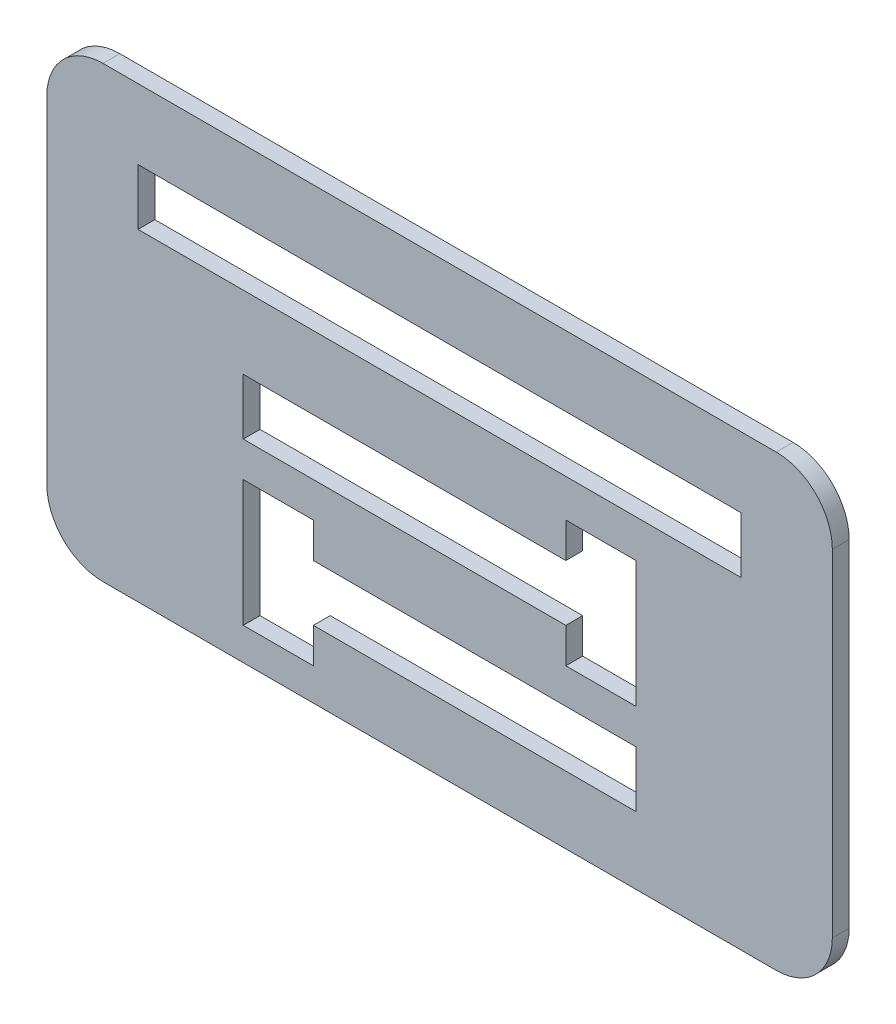
ISO-10303-21;
HEADER;
FILE_DESCRIPTION(('STEP AP214'),'2;1');
FILE_NAME('part.step','',(''),(''),'','','');
FILE_SCHEMA(('AUTOMOTIVE_DESIGN { 1 0 10303 214 1 1 1 1 }'));
ENDSEC;
DATA;
#1=APPLICATION_CONTEXT('core data for automotive mechanical design processes');
#2=APPLICATION_PROTOCOL_DEFINITION('international standard','automotive_design',2000,#1);
#3=PRODUCT_CONTEXT('',#1,'mechanical');
#4=PRODUCT('Part','Part','',(#3));
#5=PRODUCT_RELATED_PRODUCT_CATEGORY('part','',(#4));
#6=PRODUCT_DEFINITION_FORMATION('','',#4);
#7=PRODUCT_DEFINITION_CONTEXT('part definition',#1,'design');
#8=PRODUCT_DEFINITION('design','',#6,#7);
#9=PRODUCT_DEFINITION_SHAPE('','',#8);
#10=(LENGTH_UNIT() NAMED_UNIT(*) SI_UNIT(.MILLI.,.METRE.));
#11=(NAMED_UNIT(*) PLANE_ANGLE_UNIT() SI_UNIT($,.RADIAN.));
#12=(NAMED_UNIT(*) SI_UNIT($,.STERADIAN.) SOLID_ANGLE_UNIT());
#13=UNCERTAINTY_MEASURE_WITH_UNIT(LENGTH_MEASURE(1.E-05),#10,'distance_accuracy_value','');
#14=(GEOMETRIC_REPRESENTATION_CONTEXT(3) GLOBAL_UNCERTAINTY_ASSIGNED_CONTEXT((#13)) GLOBAL_UNIT_ASSIGNED_CONTEXT((#10,
#11,#12)) REPRESENTATION_CONTEXT('',''));
#15=CARTESIAN_POINT('',(0.,0.,0.));
#16=DIRECTION('',(0.,0.,1.));
#17=DIRECTION('',(1.,0.,0.));
#18=AXIS2_PLACEMENT_3D('',#15,#16,#17);
#19=CARTESIAN_POINT('',(260.,20.,6.));
#20=DIRECTION('',(0.,0.,-1.));
#21=DIRECTION('',(-1.,0.,0.));
#22=AXIS2_PLACEMENT_3D('',#19,#20,#21);
#23=CYLINDRICAL_SURFACE('',#22,20.);
#24=CARTESIAN_POINT('',(260.,20.,0.));
#25=DIRECTION('',(0.,0.,1.));
#26=DIRECTION('',(1.,0.,0.));
#27=AXIS2_PLACEMENT_3D('',#24,#25,#26);
#28=CIRCLE('',#27,20.);
#29=CARTESIAN_POINT('',(260.,0.,0.));
#30=VERTEX_POINT('',#29);
#31=CARTESIAN_POINT('',(280.,20.0000000000001,0.));
#32=VERTEX_POINT('',#31);
#33=EDGE_CURVE('E376',#30,#32,#28,.T.);
#34=ORIENTED_EDGE('',*,*,#33,.T.);
#35=DIRECTION('',(0.,0.,-1.));
#36=VECTOR('',#35,1.);
#37=CARTESIAN_POINT('',(280.,20.0000000000001,6.));
#38=LINE('',#37,#36);
#39=CARTESIAN_POINT('',(280.,20.0000000000001,6.));
#40=VERTEX_POINT('',#39);
#41=EDGE_CURVE('E11',#40,#32,#38,.T.);
#42=ORIENTED_EDGE('',*,*,#41,.F.);
#43=CARTESIAN_POINT('',(260.,20.,6.));
#44=DIRECTION('',(0.,0.,1.));
#45=DIRECTION('',(1.,0.,0.));
#46=AXIS2_PLACEMENT_3D('',#43,#44,#45);
#47=CIRCLE('',#46,20.);
#48=CARTESIAN_POINT('',(260.,0.,6.));
#49=VERTEX_POINT('',#48);
#50=EDGE_CURVE('E383',#49,#40,#47,.T.);
#51=ORIENTED_EDGE('',*,*,#50,.F.);
#52=DIRECTION('',(0.,0.,-1.));
#53=VECTOR('',#52,1.);
#54=CARTESIAN_POINT('',(260.,0.,6.));
#55=LINE('',#54,#53);
#56=EDGE_CURVE('E401',#49,#30,#55,.T.);
#57=ORIENTED_EDGE('',*,*,#56,.T.);
#58=EDGE_LOOP('',(#34,#42,#51,#57));
#59=FACE_BOUND('',#58,.T.);
#60=ADVANCED_FACE('F33',(#59),#23,.T.);
#61=CARTESIAN_POINT('',(280.,20.0000000000001,6.));
#62=DIRECTION('',(-1.,0.,0.));
#63=DIRECTION('',(0.,-1.,0.));
#64=AXIS2_PLACEMENT_3D('',#61,#62,#63);
#65=PLANE('',#64);
#66=DIRECTION('',(0.,1.,0.));
#67=VECTOR('',#66,1.);
#68=CARTESIAN_POINT('',(280.,20.0000000000001,0.));
#69=LINE('',#68,#67);
#70=CARTESIAN_POINT('',(280.,140.,0.));
#71=VERTEX_POINT('',#70);
#72=EDGE_CURVE('E404',#32,#71,#69,.T.);
#73=ORIENTED_EDGE('',*,*,#72,.T.);
#74=DIRECTION('',(0.,0.,-1.));
#75=VECTOR('',#74,1.);
#76=CARTESIAN_POINT('',(280.,140.,6.));
#77=LINE('',#76,#75);
#78=CARTESIAN_POINT('',(280.,140.,6.));
#79=VERTEX_POINT('',#78);
#80=EDGE_CURVE('E40',#79,#71,#77,.T.);
#81=ORIENTED_EDGE('',*,*,#80,.F.);
#82=DIRECTION('',(0.,1.,0.));
#83=VECTOR('',#82,1.);
#84=CARTESIAN_POINT('',(280.,20.0000000000001,6.));
#85=LINE('',#84,#83);
#86=EDGE_CURVE('E386',#40,#79,#85,.T.);
#87=ORIENTED_EDGE('',*,*,#86,.F.);
#88=ORIENTED_EDGE('',*,*,#41,.T.);
#89=EDGE_LOOP('',(#73,#81,#87,#88));
#90=FACE_BOUND('',#89,.T.);
#91=ADVANCED_FACE('F460',(#90),#65,.F.);
#92=CARTESIAN_POINT('',(260.,140.,6.));
#93=DIRECTION('',(0.,0.,-1.));
#94=DIRECTION('',(-1.,0.,0.));
#95=AXIS2_PLACEMENT_3D('',#92,#93,#94);
#96=CYLINDRICAL_SURFACE('',#95,20.);
#97=CARTESIAN_POINT('',(260.,140.,0.));
#98=DIRECTION('',(0.,0.,1.));
#99=DIRECTION('',(-1.,0.,0.));
#100=AXIS2_PLACEMENT_3D('',#97,#98,#99);
#101=CIRCLE('',#100,20.);
#102=CARTESIAN_POINT('',(260.,160.,0.));
#103=VERTEX_POINT('',#102);
#104=EDGE_CURVE('E406',#71,#103,#101,.T.);
#105=ORIENTED_EDGE('',*,*,#104,.T.);
#106=DIRECTION('',(0.,0.,-1.));
#107=VECTOR('',#106,1.);
#108=CARTESIAN_POINT('',(260.,160.,6.));
#109=LINE('',#108,#107);
#110=CARTESIAN_POINT('',(260.,160.,6.));
#111=VERTEX_POINT('',#110);
#112=EDGE_CURVE('E431',#111,#103,#109,.T.);
#113=ORIENTED_EDGE('',*,*,#112,.F.);
#114=CARTESIAN_POINT('',(260.,140.,6.));
#115=DIRECTION('',(0.,0.,1.));
#116=DIRECTION('',(-1.,0.,0.));
#117=AXIS2_PLACEMENT_3D('',#114,#115,#116);
#118=CIRCLE('',#117,20.);
#119=EDGE_CURVE('E389',#79,#111,#118,.T.);
#120=ORIENTED_EDGE('',*,*,#119,.F.);
#121=ORIENTED_EDGE('',*,*,#80,.T.);
#122=EDGE_LOOP('',(#105,#113,#120,#121));
#123=FACE_BOUND('',#122,.T.);
#124=ADVANCED_FACE('F438',(#123),#96,.T.);
#125=CARTESIAN_POINT('',(20.0000000000001,160.,6.));
#126=DIRECTION('',(0.,-1.,0.));
#127=DIRECTION('',(0.,0.,-1.));
#128=AXIS2_PLACEMENT_3D('',#125,#126,#127);
#129=PLANE('',#128);
#130=DIRECTION('',(-1.,0.,0.));
#131=VECTOR('',#130,1.);
#132=CARTESIAN_POINT('',(20.0000000000001,160.,0.));
#133=LINE('',#132,#131);
#134=CARTESIAN_POINT('',(20.0000000000001,160.,0.));
#135=VERTEX_POINT('',#134);
#136=EDGE_CURVE('E408',#103,#135,#133,.T.);
#137=ORIENTED_EDGE('',*,*,#136,.T.);
#138=DIRECTION('',(0.,0.,-1.));
#139=VECTOR('',#138,1.);
#140=CARTESIAN_POINT('',(20.0000000000001,160.,6.));
#141=LINE('',#140,#139);
#142=CARTESIAN_POINT('',(20.0000000000001,160.,6.));
#143=VERTEX_POINT('',#142);
#144=EDGE_CURVE('E428',#143,#135,#141,.T.);
#145=ORIENTED_EDGE('',*,*,#144,.F.);
#146=DIRECTION('',(-1.,0.,0.));
#147=VECTOR('',#146,1.);
#148=CARTESIAN_POINT('',(20.0000000000001,160.,6.));
#149=LINE('',#148,#147);
#150=EDGE_CURVE('E391',#111,#143,#149,.T.);
#151=ORIENTED_EDGE('',*,*,#150,.F.);
#152=ORIENTED_EDGE('',*,*,#112,.T.);
#153=EDGE_LOOP('',(#137,#145,#151,#152));
#154=FACE_BOUND('',#153,.T.);
#155=ADVANCED_FACE('F448',(#154),#129,.F.);
#156=CARTESIAN_POINT('',(20.,140.,6.));
#157=DIRECTION('',(0.,0.,-1.));
#158=DIRECTION('',(-1.,0.,0.));
#159=AXIS2_PLACEMENT_3D('',#156,#157,#158);
#160=CYLINDRICAL_SURFACE('',#159,20.);
#161=CARTESIAN_POINT('',(20.,140.,0.));
#162=DIRECTION('',(0.,0.,1.));
#163=DIRECTION('',(-1.,0.,0.));
#164=AXIS2_PLACEMENT_3D('',#161,#162,#163);
#165=CIRCLE('',#164,20.);
#166=CARTESIAN_POINT('',(0.,140.,0.));
#167=VERTEX_POINT('',#166);
#168=EDGE_CURVE('E410',#135,#167,#165,.T.);
#169=ORIENTED_EDGE('',*,*,#168,.T.);
#170=DIRECTION('',(0.,0.,-1.));
#171=VECTOR('',#170,1.);
#172=CARTESIAN_POINT('',(0.,140.,6.));
#173=LINE('',#172,#171);
#174=CARTESIAN_POINT('',(0.,140.,6.));
#175=VERTEX_POINT('',#174);
#176=EDGE_CURVE('E425',#175,#167,#173,.T.);
#177=ORIENTED_EDGE('',*,*,#176,.F.);
#178=CARTESIAN_POINT('',(20.,140.,6.));
#179=DIRECTION('',(0.,0.,1.));
#180=DIRECTION('',(-1.,0.,0.));
#181=AXIS2_PLACEMENT_3D('',#178,#179,#180);
#182=CIRCLE('',#181,20.);
#183=EDGE_CURVE('E393',#143,#175,#182,.T.);
#184=ORIENTED_EDGE('',*,*,#183,.F.);
#185=ORIENTED_EDGE('',*,*,#144,.T.);
#186=EDGE_LOOP('',(#169,#177,#184,#185));
#187=FACE_BOUND('',#186,.T.);
#188=ADVANCED_FACE('F452',(#187),#160,.T.);
#189=CARTESIAN_POINT('',(0.,20.0000000000001,6.));
#190=DIRECTION('',(1.,0.,0.));
#191=DIRECTION('',(0.,1.,0.));
#192=AXIS2_PLACEMENT_3D('',#189,#190,#191);
#193=PLANE('',#192);
#194=DIRECTION('',(0.,-1.,0.));
#195=VECTOR('',#194,1.);
#196=CARTESIAN_POINT('',(0.,20.0000000000001,0.));
#197=LINE('',#196,#195);
#198=CARTESIAN_POINT('',(0.,20.,0.));
#199=VERTEX_POINT('',#198);
#200=EDGE_CURVE('E412',#167,#199,#197,.T.);
#201=ORIENTED_EDGE('',*,*,#200,.T.);
#202=DIRECTION('',(0.,0.,-1.));
#203=VECTOR('',#202,1.);
#204=CARTESIAN_POINT('',(0.,20.,6.));
#205=LINE('',#204,#203);
#206=CARTESIAN_POINT('',(0.,20.,6.));
#207=VERTEX_POINT('',#206);
#208=EDGE_CURVE('E422',#207,#199,#205,.T.);
#209=ORIENTED_EDGE('',*,*,#208,.F.);
#210=DIRECTION('',(0.,-1.,0.));
#211=VECTOR('',#210,1.);
#212=CARTESIAN_POINT('',(0.,20.0000000000001,6.));
#213=LINE('',#212,#211);
#214=EDGE_CURVE('E395',#175,#207,#213,.T.);
#215=ORIENTED_EDGE('',*,*,#214,.F.);
#216=ORIENTED_EDGE('',*,*,#176,.T.);
#217=EDGE_LOOP('',(#201,#209,#215,#216));
#218=FACE_BOUND('',#217,.T.);
#219=ADVANCED_FACE('F473',(#218),#193,.F.);
#220=CARTESIAN_POINT('',(20.,20.,6.));
#221=DIRECTION('',(0.,0.,-1.));
#222=DIRECTION('',(-1.,0.,0.));
#223=AXIS2_PLACEMENT_3D('',#220,#221,#222);
#224=CYLINDRICAL_SURFACE('',#223,20.);
#225=CARTESIAN_POINT('',(20.,20.,0.));
#226=DIRECTION('',(0.,0.,1.));
#227=DIRECTION('',(-1.,0.,0.));
#228=AXIS2_PLACEMENT_3D('',#225,#226,#227);
#229=CIRCLE('',#228,20.);
#230=CARTESIAN_POINT('',(20.0000000000001,0.,0.));
#231=VERTEX_POINT('',#230);
#232=EDGE_CURVE('E414',#199,#231,#229,.T.);
#233=ORIENTED_EDGE('',*,*,#232,.T.);
#234=DIRECTION('',(0.,0.,-1.));
#235=VECTOR('',#234,1.);
#236=CARTESIAN_POINT('',(20.0000000000001,0.,6.));
#237=LINE('',#236,#235);
#238=CARTESIAN_POINT('',(20.0000000000001,0.,6.));
#239=VERTEX_POINT('',#238);
#240=EDGE_CURVE('E419',#239,#231,#237,.T.);
#241=ORIENTED_EDGE('',*,*,#240,.F.);
#242=CARTESIAN_POINT('',(20.,20.,6.));
#243=DIRECTION('',(0.,0.,1.));
#244=DIRECTION('',(-1.,0.,0.));
#245=AXIS2_PLACEMENT_3D('',#242,#243,#244);
#246=CIRCLE('',#245,20.);
#247=EDGE_CURVE('E397',#207,#239,#246,.T.);
#248=ORIENTED_EDGE('',*,*,#247,.F.);
#249=ORIENTED_EDGE('',*,*,#208,.T.);
#250=EDGE_LOOP('',(#233,#241,#248,#249));
#251=FACE_BOUND('',#250,.T.);
#252=ADVANCED_FACE('F471',(#251),#224,.T.);
#253=CARTESIAN_POINT('',(20.0000000000001,0.,6.));
#254=DIRECTION('',(0.,1.,0.));
#255=DIRECTION('',(0.,0.,1.));
#256=AXIS2_PLACEMENT_3D('',#253,#254,#255);
#257=PLANE('',#256);
#258=DIRECTION('',(1.,0.,0.));
#259=VECTOR('',#258,1.);
#260=CARTESIAN_POINT('',(20.0000000000001,0.,0.));
#261=LINE('',#260,#259);
#262=EDGE_CURVE('E387',#231,#30,#261,.T.);
#263=ORIENTED_EDGE('',*,*,#262,.T.);
#264=ORIENTED_EDGE('',*,*,#56,.F.);
#265=DIRECTION('',(1.,0.,0.));
#266=VECTOR('',#265,1.);
#267=CARTESIAN_POINT('',(20.0000000000001,0.,6.));
#268=LINE('',#267,#266);
#269=EDGE_CURVE('E399',#239,#49,#268,.T.);
#270=ORIENTED_EDGE('',*,*,#269,.F.);
#271=ORIENTED_EDGE('',*,*,#240,.T.);
#272=EDGE_LOOP('',(#263,#264,#270,#271));
#273=FACE_BOUND('',#272,.T.);
#274=ADVANCED_FACE('F466',(#273),#257,.F.);
#275=CARTESIAN_POINT('',(260.,20.,6.));
#276=DIRECTION('',(0.,0.,1.));
#277=DIRECTION('',(1.,0.,0.));
#278=AXIS2_PLACEMENT_3D('',#275,#276,#277);
#279=PLANE('',#278);
#280=DIRECTION('',(-1.,0.,0.));
#281=VECTOR('',#280,1.);
#282=CARTESIAN_POINT('',(95.,56.5139018339302,6.));
#283=LINE('',#282,#281);
#284=CARTESIAN_POINT('',(95.,56.5139018339302,6.));
#285=VERTEX_POINT('',#284);
#286=CARTESIAN_POINT('',(70.,56.5139018339302,6.));
#287=VERTEX_POINT('',#286);
#288=EDGE_CURVE('E47',#285,#287,#283,.T.);
#289=ORIENTED_EDGE('',*,*,#288,.F.);
#290=DIRECTION('',(0.,1.,0.));
#291=VECTOR('',#290,1.);
#292=CARTESIAN_POINT('',(95.,56.5139018339302,6.));
#293=LINE('',#292,#291);
#294=CARTESIAN_POINT('',(95.,44.0139018339303,6.));
#295=VERTEX_POINT('',#294);
#296=EDGE_CURVE('E239',#295,#285,#293,.T.);
#297=ORIENTED_EDGE('',*,*,#296,.F.);
#298=DIRECTION('',(-1.,0.,0.));
#299=VECTOR('',#298,1.);
#300=CARTESIAN_POINT('',(210.,44.0139018339303,6.));
#301=LINE('',#300,#299);
#302=CARTESIAN_POINT('',(210.,44.0139018339303,6.));
#303=VERTEX_POINT('',#302);
#304=EDGE_CURVE('E242',#303,#295,#301,.T.);
#305=ORIENTED_EDGE('',*,*,#304,.F.);
#306=DIRECTION('',(0.,1.,0.));
#307=VECTOR('',#306,1.);
#308=CARTESIAN_POINT('',(210.,44.0139018339303,6.));
#309=LINE('',#308,#307);
#310=CARTESIAN_POINT('',(210.,24.0139018339303,6.));
#311=VERTEX_POINT('',#310);
#312=EDGE_CURVE('E270',#311,#303,#309,.T.);
#313=ORIENTED_EDGE('',*,*,#312,.F.);
#314=DIRECTION('',(1.,0.,0.));
#315=VECTOR('',#314,1.);
#316=CARTESIAN_POINT('',(210.,24.0139018339303,6.));
#317=LINE('',#316,#315);
#318=CARTESIAN_POINT('',(95.0000000000001,24.0139018339303,6.));
#319=VERTEX_POINT('',#318);
#320=EDGE_CURVE('E267',#319,#311,#317,.T.);
#321=ORIENTED_EDGE('',*,*,#320,.F.);
#322=DIRECTION('',(0.,1.,0.));
#323=VECTOR('',#322,1.);
#324=CARTESIAN_POINT('',(95.0000000000001,24.0139018339303,6.));
#325=LINE('',#324,#323);
#326=CARTESIAN_POINT('',(95.0000000000001,11.5139018339303,6.));
#327=VERTEX_POINT('',#326);
#328=EDGE_CURVE('E264',#327,#319,#325,.T.);
#329=ORIENTED_EDGE('',*,*,#328,.F.);
#330=DIRECTION('',(1.,0.,0.));
#331=VECTOR('',#330,1.);
#332=CARTESIAN_POINT('',(95.0000000000001,11.5139018339303,6.));
#333=LINE('',#332,#331);
#334=CARTESIAN_POINT('',(70.,11.5139018339303,6.));
#335=VERTEX_POINT('',#334);
#336=EDGE_CURVE('E261',#335,#327,#333,.T.);
#337=ORIENTED_EDGE('',*,*,#336,.F.);
#338=DIRECTION('',(0.,-1.,0.));
#339=VECTOR('',#338,1.);
#340=CARTESIAN_POINT('',(70.,56.5139018339302,6.));
#341=LINE('',#340,#339);
#342=EDGE_CURVE('E259',#287,#335,#341,.T.);
#343=ORIENTED_EDGE('',*,*,#342,.F.);
#344=EDGE_LOOP('',(#289,#297,#305,#313,#321,#329,#337,#343));
#345=FACE_BOUND('',#344,.T.);
#346=DIRECTION('',(0.,-1.,0.));
#347=VECTOR('',#346,1.);
#348=CARTESIAN_POINT('',(70.,89.0139018339302,6.));
#349=LINE('',#348,#347);
#350=CARTESIAN_POINT('',(70.,89.0139018339302,6.));
#351=VERTEX_POINT('',#350);
#352=CARTESIAN_POINT('',(70.,69.0139018339302,6.));
#353=VERTEX_POINT('',#352);
#354=EDGE_CURVE('E55',#351,#353,#349,.T.);
#355=ORIENTED_EDGE('',*,*,#354,.F.);
#356=DIRECTION('',(-1.,0.,0.));
#357=VECTOR('',#356,1.);
#358=CARTESIAN_POINT('',(70.,89.0139018339302,6.));
#359=LINE('',#358,#357);
#360=CARTESIAN_POINT('',(185.,89.0139018339302,6.));
#361=VERTEX_POINT('',#360);
#362=EDGE_CURVE('E292',#361,#351,#359,.T.);
#363=ORIENTED_EDGE('',*,*,#362,.F.);
#364=DIRECTION('',(0.,-1.,0.));
#365=VECTOR('',#364,1.);
#366=CARTESIAN_POINT('',(185.,101.51390183393,6.));
#367=LINE('',#366,#365);
#368=CARTESIAN_POINT('',(185.,101.51390183393,6.));
#369=VERTEX_POINT('',#368);
#370=EDGE_CURVE('E330',#369,#361,#367,.T.);
#371=ORIENTED_EDGE('',*,*,#370,.F.);
#372=DIRECTION('',(-1.,0.,0.));
#373=VECTOR('',#372,1.);
#374=CARTESIAN_POINT('',(185.,101.51390183393,6.));
#375=LINE('',#374,#373);
#376=CARTESIAN_POINT('',(210.,101.51390183393,6.));
#377=VERTEX_POINT('',#376);
#378=EDGE_CURVE('E327',#377,#369,#375,.T.);
#379=ORIENTED_EDGE('',*,*,#378,.F.);
#380=DIRECTION('',(0.,1.,0.));
#381=VECTOR('',#380,1.);
#382=CARTESIAN_POINT('',(210.,101.51390183393,6.));
#383=LINE('',#382,#381);
#384=CARTESIAN_POINT('',(210.,56.5139018339302,6.));
#385=VERTEX_POINT('',#384);
#386=EDGE_CURVE('E324',#385,#377,#383,.T.);
#387=ORIENTED_EDGE('',*,*,#386,.F.);
#388=DIRECTION('',(1.,0.,0.));
#389=VECTOR('',#388,1.);
#390=CARTESIAN_POINT('',(185.,56.5139018339302,6.));
#391=LINE('',#390,#389);
#392=CARTESIAN_POINT('',(185.,56.5139018339302,6.));
#393=VERTEX_POINT('',#392);
#394=EDGE_CURVE('E321',#393,#385,#391,.T.);
#395=ORIENTED_EDGE('',*,*,#394,.F.);
#396=DIRECTION('',(0.,-1.,0.));
#397=VECTOR('',#396,1.);
#398=CARTESIAN_POINT('',(185.,69.0139018339302,6.));
#399=LINE('',#398,#397);
#400=CARTESIAN_POINT('',(185.,69.0139018339302,6.));
#401=VERTEX_POINT('',#400);
#402=EDGE_CURVE('E318',#401,#393,#399,.T.);
#403=ORIENTED_EDGE('',*,*,#402,.F.);
#404=DIRECTION('',(1.,0.,0.));
#405=VECTOR('',#404,1.);
#406=CARTESIAN_POINT('',(70.,69.0139018339302,6.));
#407=LINE('',#406,#405);
#408=EDGE_CURVE('E315',#353,#401,#407,.T.);
#409=ORIENTED_EDGE('',*,*,#408,.F.);
#410=EDGE_LOOP('',(#355,#363,#371,#379,#387,#395,#403,#409));
#411=FACE_BOUND('',#410,.T.);
#412=DIRECTION('',(0.,-1.,0.));
#413=VECTOR('',#412,1.);
#414=CARTESIAN_POINT('',(32.5,135.,6.));
#415=LINE('',#414,#413);
#416=CARTESIAN_POINT('',(32.5,135.,6.));
#417=VERTEX_POINT('',#416);
#418=CARTESIAN_POINT('',(32.5,115.,6.));
#419=VERTEX_POINT('',#418);
#420=EDGE_CURVE('E337',#417,#419,#415,.T.);
#421=ORIENTED_EDGE('',*,*,#420,.F.);
#422=DIRECTION('',(-1.,0.,0.));
#423=VECTOR('',#422,1.);
#424=CARTESIAN_POINT('',(32.5,135.,6.));
#425=LINE('',#424,#423);
#426=CARTESIAN_POINT('',(247.5,135.,6.));
#427=VERTEX_POINT('',#426);
#428=EDGE_CURVE('E355',#427,#417,#425,.T.);
#429=ORIENTED_EDGE('',*,*,#428,.F.);
#430=DIRECTION('',(0.,1.,0.));
#431=VECTOR('',#430,1.);
#432=CARTESIAN_POINT('',(247.5,135.,6.));
#433=LINE('',#432,#431);
#434=CARTESIAN_POINT('',(247.5,115.,6.));
#435=VERTEX_POINT('',#434);
#436=EDGE_CURVE('E369',#435,#427,#433,.T.);
#437=ORIENTED_EDGE('',*,*,#436,.F.);
#438=DIRECTION('',(1.,0.,0.));
#439=VECTOR('',#438,1.);
#440=CARTESIAN_POINT('',(32.5,115.,6.));
#441=LINE('',#440,#439);
#442=EDGE_CURVE('E366',#419,#435,#441,.T.);
#443=ORIENTED_EDGE('',*,*,#442,.F.);
#444=EDGE_LOOP('',(#421,#429,#437,#443));
#445=FACE_BOUND('',#444,.T.);
#446=ORIENTED_EDGE('',*,*,#50,.T.);
#447=ORIENTED_EDGE('',*,*,#86,.T.);
#448=ORIENTED_EDGE('',*,*,#119,.T.);
#449=ORIENTED_EDGE('',*,*,#150,.T.);
#450=ORIENTED_EDGE('',*,*,#183,.T.);
#451=ORIENTED_EDGE('',*,*,#214,.T.);
#452=ORIENTED_EDGE('',*,*,#247,.T.);
#453=ORIENTED_EDGE('',*,*,#269,.T.);
#454=EDGE_LOOP('',(#446,#447,#448,#449,#450,#451,#452,#453));
#455=FACE_BOUND('',#454,.T.);
#456=ADVANCED_FACE('F456',(#345,#411,#445,#455),#279,.T.);
#457=CARTESIAN_POINT('',(260.,20.,0.));
#458=DIRECTION('',(0.,0.,1.));
#459=DIRECTION('',(1.,0.,0.));
#460=AXIS2_PLACEMENT_3D('',#457,#458,#459);
#461=PLANE('',#460);
#462=DIRECTION('',(0.,1.,0.));
#463=VECTOR('',#462,1.);
#464=CARTESIAN_POINT('',(95.,56.5139018339302,0.));
#465=LINE('',#464,#463);
#466=CARTESIAN_POINT('',(95.,44.0139018339303,0.));
#467=VERTEX_POINT('',#466);
#468=CARTESIAN_POINT('',(95.,56.5139018339302,0.));
#469=VERTEX_POINT('',#468);
#470=EDGE_CURVE('E225',#467,#469,#465,.T.);
#471=ORIENTED_EDGE('',*,*,#470,.T.);
#472=DIRECTION('',(-1.,0.,0.));
#473=VECTOR('',#472,1.);
#474=CARTESIAN_POINT('',(95.,56.5139018339302,0.));
#475=LINE('',#474,#473);
#476=CARTESIAN_POINT('',(70.,56.5139018339302,0.));
#477=VERTEX_POINT('',#476);
#478=EDGE_CURVE('E219',#469,#477,#475,.T.);
#479=ORIENTED_EDGE('',*,*,#478,.T.);
#480=DIRECTION('',(0.,-1.,0.));
#481=VECTOR('',#480,1.);
#482=CARTESIAN_POINT('',(70.,56.5139018339302,0.));
#483=LINE('',#482,#481);
#484=CARTESIAN_POINT('',(70.,11.5139018339303,0.));
#485=VERTEX_POINT('',#484);
#486=EDGE_CURVE('E229',#477,#485,#483,.T.);
#487=ORIENTED_EDGE('',*,*,#486,.T.);
#488=DIRECTION('',(1.,0.,0.));
#489=VECTOR('',#488,1.);
#490=CARTESIAN_POINT('',(95.0000000000001,11.5139018339303,0.));
#491=LINE('',#490,#489);
#492=CARTESIAN_POINT('',(95.0000000000001,11.5139018339303,0.));
#493=VERTEX_POINT('',#492);
#494=EDGE_CURVE('E233',#485,#493,#491,.T.);
#495=ORIENTED_EDGE('',*,*,#494,.T.);
#496=DIRECTION('',(0.,1.,0.));
#497=VECTOR('',#496,1.);
#498=CARTESIAN_POINT('',(95.0000000000001,24.0139018339303,0.));
#499=LINE('',#498,#497);
#500=CARTESIAN_POINT('',(95.0000000000001,24.0139018339303,0.));
#501=VERTEX_POINT('',#500);
#502=EDGE_CURVE('E246',#493,#501,#499,.T.);
#503=ORIENTED_EDGE('',*,*,#502,.T.);
#504=DIRECTION('',(1.,0.,0.));
#505=VECTOR('',#504,1.);
#506=CARTESIAN_POINT('',(210.,24.0139018339303,0.));
#507=LINE('',#506,#505);
#508=CARTESIAN_POINT('',(210.,24.0139018339303,0.));
#509=VERTEX_POINT('',#508);
#510=EDGE_CURVE('E249',#501,#509,#507,.T.);
#511=ORIENTED_EDGE('',*,*,#510,.T.);
#512=DIRECTION('',(0.,1.,0.));
#513=VECTOR('',#512,1.);
#514=CARTESIAN_POINT('',(210.,44.0139018339303,0.));
#515=LINE('',#514,#513);
#516=CARTESIAN_POINT('',(210.,44.0139018339303,0.));
#517=VERTEX_POINT('',#516);
#518=EDGE_CURVE('E252',#509,#517,#515,.T.);
#519=ORIENTED_EDGE('',*,*,#518,.T.);
#520=DIRECTION('',(-1.,0.,0.));
#521=VECTOR('',#520,1.);
#522=CARTESIAN_POINT('',(210.,44.0139018339303,0.));
#523=LINE('',#522,#521);
#524=EDGE_CURVE('E255',#517,#467,#523,.T.);
#525=ORIENTED_EDGE('',*,*,#524,.T.);
#526=EDGE_LOOP('',(#471,#479,#487,#495,#503,#511,#519,#525));
#527=FACE_BOUND('',#526,.T.);
#528=DIRECTION('',(-1.,0.,0.));
#529=VECTOR('',#528,1.);
#530=CARTESIAN_POINT('',(70.,89.0139018339302,0.));
#531=LINE('',#530,#529);
#532=CARTESIAN_POINT('',(185.,89.0139018339302,0.));
#533=VERTEX_POINT('',#532);
#534=CARTESIAN_POINT('',(70.,89.0139018339302,0.));
#535=VERTEX_POINT('',#534);
#536=EDGE_CURVE('E310',#533,#535,#531,.T.);
#537=ORIENTED_EDGE('',*,*,#536,.T.);
#538=DIRECTION('',(0.,-1.,0.));
#539=VECTOR('',#538,1.);
#540=CARTESIAN_POINT('',(70.,89.0139018339302,0.));
#541=LINE('',#540,#539);
#542=CARTESIAN_POINT('',(70.,69.0139018339302,0.));
#543=VERTEX_POINT('',#542);
#544=EDGE_CURVE('E288',#535,#543,#541,.T.);
#545=ORIENTED_EDGE('',*,*,#544,.T.);
#546=DIRECTION('',(1.,0.,0.));
#547=VECTOR('',#546,1.);
#548=CARTESIAN_POINT('',(70.,69.0139018339302,0.));
#549=LINE('',#548,#547);
#550=CARTESIAN_POINT('',(185.,69.0139018339302,0.));
#551=VERTEX_POINT('',#550);
#552=EDGE_CURVE('E291',#543,#551,#549,.T.);
#553=ORIENTED_EDGE('',*,*,#552,.T.);
#554=DIRECTION('',(0.,-1.,0.));
#555=VECTOR('',#554,1.);
#556=CARTESIAN_POINT('',(185.,69.0139018339302,0.));
#557=LINE('',#556,#555);
#558=CARTESIAN_POINT('',(185.,56.5139018339302,0.));
#559=VERTEX_POINT('',#558);
#560=EDGE_CURVE('E295',#551,#559,#557,.T.);
#561=ORIENTED_EDGE('',*,*,#560,.T.);
#562=DIRECTION('',(1.,0.,0.));
#563=VECTOR('',#562,1.);
#564=CARTESIAN_POINT('',(185.,56.5139018339302,0.));
#565=LINE('',#564,#563);
#566=CARTESIAN_POINT('',(210.,56.5139018339302,0.));
#567=VERTEX_POINT('',#566);
#568=EDGE_CURVE('E298',#559,#567,#565,.T.);
#569=ORIENTED_EDGE('',*,*,#568,.T.);
#570=DIRECTION('',(0.,1.,0.));
#571=VECTOR('',#570,1.);
#572=CARTESIAN_POINT('',(210.,101.51390183393,0.));
#573=LINE('',#572,#571);
#574=CARTESIAN_POINT('',(210.,101.51390183393,0.));
#575=VERTEX_POINT('',#574);
#576=EDGE_CURVE('E301',#567,#575,#573,.T.);
#577=ORIENTED_EDGE('',*,*,#576,.T.);
#578=DIRECTION('',(-1.,0.,0.));
#579=VECTOR('',#578,1.);
#580=CARTESIAN_POINT('',(185.,101.51390183393,0.));
#581=LINE('',#580,#579);
#582=CARTESIAN_POINT('',(185.,101.51390183393,0.));
#583=VERTEX_POINT('',#582);
#584=EDGE_CURVE('E304',#575,#583,#581,.T.);
#585=ORIENTED_EDGE('',*,*,#584,.T.);
#586=DIRECTION('',(0.,-1.,0.));
#587=VECTOR('',#586,1.);
#588=CARTESIAN_POINT('',(185.,101.51390183393,0.));
#589=LINE('',#588,#587);
#590=EDGE_CURVE('E307',#583,#533,#589,.T.);
#591=ORIENTED_EDGE('',*,*,#590,.T.);
#592=EDGE_LOOP('',(#537,#545,#553,#561,#569,#577,#585,#591));
#593=FACE_BOUND('',#592,.T.);
#594=DIRECTION('',(-1.,0.,0.));
#595=VECTOR('',#594,1.);
#596=CARTESIAN_POINT('',(32.5,135.,0.));
#597=LINE('',#596,#595);
#598=CARTESIAN_POINT('',(247.5,135.,0.));
#599=VERTEX_POINT('',#598);
#600=CARTESIAN_POINT('',(32.5,135.,0.));
#601=VERTEX_POINT('',#600);
#602=EDGE_CURVE('E361',#599,#601,#597,.T.);
#603=ORIENTED_EDGE('',*,*,#602,.T.);
#604=DIRECTION('',(0.,-1.,0.));
#605=VECTOR('',#604,1.);
#606=CARTESIAN_POINT('',(32.5,135.,0.));
#607=LINE('',#606,#605);
#608=CARTESIAN_POINT('',(32.5,115.,0.));
#609=VERTEX_POINT('',#608);
#610=EDGE_CURVE('E351',#601,#609,#607,.T.);
#611=ORIENTED_EDGE('',*,*,#610,.T.);
#612=DIRECTION('',(1.,0.,0.));
#613=VECTOR('',#612,1.);
#614=CARTESIAN_POINT('',(32.5,115.,0.));
#615=LINE('',#614,#613);
#616=CARTESIAN_POINT('',(247.5,115.,0.));
#617=VERTEX_POINT('',#616);
#618=EDGE_CURVE('E354',#609,#617,#615,.T.);
#619=ORIENTED_EDGE('',*,*,#618,.T.);
#620=DIRECTION('',(0.,1.,0.));
#621=VECTOR('',#620,1.);
#622=CARTESIAN_POINT('',(247.5,135.,0.));
#623=LINE('',#622,#621);
#624=EDGE_CURVE('E358',#617,#599,#623,.T.);
#625=ORIENTED_EDGE('',*,*,#624,.T.);
#626=EDGE_LOOP('',(#603,#611,#619,#625));
#627=FACE_BOUND('',#626,.T.);
#628=ORIENTED_EDGE('',*,*,#33,.F.);
#629=ORIENTED_EDGE('',*,*,#262,.F.);
#630=ORIENTED_EDGE('',*,*,#232,.F.);
#631=ORIENTED_EDGE('',*,*,#200,.F.);
#632=ORIENTED_EDGE('',*,*,#168,.F.);
#633=ORIENTED_EDGE('',*,*,#136,.F.);
#634=ORIENTED_EDGE('',*,*,#104,.F.);
#635=ORIENTED_EDGE('',*,*,#72,.F.);
#636=EDGE_LOOP('',(#628,#629,#630,#631,#632,#633,#634,#635));
#637=FACE_BOUND('',#636,.T.);
#638=ADVANCED_FACE('F235',(#527,#593,#627,#637),#461,.F.);
#639=CARTESIAN_POINT('',(32.5,135.,0.));
#640=DIRECTION('',(-1.,0.,0.));
#641=DIRECTION('',(0.,-1.,0.));
#642=AXIS2_PLACEMENT_3D('',#639,#640,#641);
#643=PLANE('',#642);
#644=ORIENTED_EDGE('',*,*,#420,.T.);
#645=DIRECTION('',(0.,0.,1.));
#646=VECTOR('',#645,1.);
#647=CARTESIAN_POINT('',(32.5,115.,0.));
#648=LINE('',#647,#646);
#649=EDGE_CURVE('E364',#609,#419,#648,.T.);
#650=ORIENTED_EDGE('',*,*,#649,.F.);
#651=ORIENTED_EDGE('',*,*,#610,.F.);
#652=DIRECTION('',(0.,0.,1.));
#653=VECTOR('',#652,1.);
#654=CARTESIAN_POINT('',(32.5,135.,0.));
#655=LINE('',#654,#653);
#656=EDGE_CURVE('E374',#601,#417,#655,.T.);
#657=ORIENTED_EDGE('',*,*,#656,.T.);
#658=EDGE_LOOP('',(#644,#650,#651,#657));
#659=FACE_BOUND('',#658,.T.);
#660=ADVANCED_FACE('F536',(#659),#643,.F.);
#661=CARTESIAN_POINT('',(32.5,135.,0.));
#662=DIRECTION('',(0.,1.,0.));
#663=DIRECTION('',(0.,0.,1.));
#664=AXIS2_PLACEMENT_3D('',#661,#662,#663);
#665=PLANE('',#664);
#666=ORIENTED_EDGE('',*,*,#428,.T.);
#667=ORIENTED_EDGE('',*,*,#656,.F.);
#668=ORIENTED_EDGE('',*,*,#602,.F.);
#669=DIRECTION('',(0.,0.,1.));
#670=VECTOR('',#669,1.);
#671=CARTESIAN_POINT('',(247.5,135.,0.));
#672=LINE('',#671,#670);
#673=EDGE_CURVE('E377',#599,#427,#672,.T.);
#674=ORIENTED_EDGE('',*,*,#673,.T.);
#675=EDGE_LOOP('',(#666,#667,#668,#674));
#676=FACE_BOUND('',#675,.T.);
#677=ADVANCED_FACE('F545',(#676),#665,.F.);
#678=CARTESIAN_POINT('',(247.5,135.,0.));
#679=DIRECTION('',(1.,0.,0.));
#680=DIRECTION('',(0.,1.,0.));
#681=AXIS2_PLACEMENT_3D('',#678,#679,#680);
#682=PLANE('',#681);
#683=ORIENTED_EDGE('',*,*,#436,.T.);
#684=ORIENTED_EDGE('',*,*,#673,.F.);
#685=ORIENTED_EDGE('',*,*,#624,.F.);
#686=DIRECTION('',(0.,0.,1.));
#687=VECTOR('',#686,1.);
#688=CARTESIAN_POINT('',(247.5,115.,0.));
#689=LINE('',#688,#687);
#690=EDGE_CURVE('E379',#617,#435,#689,.T.);
#691=ORIENTED_EDGE('',*,*,#690,.T.);
#692=EDGE_LOOP('',(#683,#684,#685,#691));
#693=FACE_BOUND('',#692,.T.);
#694=ADVANCED_FACE('F555',(#693),#682,.F.);
#695=CARTESIAN_POINT('',(32.5,115.,0.));
#696=DIRECTION('',(0.,-1.,0.));
#697=DIRECTION('',(0.,0.,-1.));
#698=AXIS2_PLACEMENT_3D('',#695,#696,#697);
#699=PLANE('',#698);
#700=ORIENTED_EDGE('',*,*,#442,.T.);
#701=ORIENTED_EDGE('',*,*,#690,.F.);
#702=ORIENTED_EDGE('',*,*,#618,.F.);
#703=ORIENTED_EDGE('',*,*,#649,.T.);
#704=EDGE_LOOP('',(#700,#701,#702,#703));
#705=FACE_BOUND('',#704,.T.);
#706=ADVANCED_FACE('F565',(#705),#699,.F.);
#707=CARTESIAN_POINT('',(70.,89.0139018339302,0.));
#708=DIRECTION('',(-1.,0.,0.));
#709=DIRECTION('',(0.,0.,1.));
#710=AXIS2_PLACEMENT_3D('',#707,#708,#709);
#711=PLANE('',#710);
#712=ORIENTED_EDGE('',*,*,#354,.T.);
#713=DIRECTION('',(0.,0.,1.));
#714=VECTOR('',#713,1.);
#715=CARTESIAN_POINT('',(70.,69.0139018339302,0.));
#716=LINE('',#715,#714);
#717=EDGE_CURVE('E313',#543,#353,#716,.T.);
#718=ORIENTED_EDGE('',*,*,#717,.F.);
#719=ORIENTED_EDGE('',*,*,#544,.F.);
#720=DIRECTION('',(0.,0.,1.));
#721=VECTOR('',#720,1.);
#722=CARTESIAN_POINT('',(70.,89.0139018339302,0.));
#723=LINE('',#722,#721);
#724=EDGE_CURVE('E335',#535,#351,#723,.T.);
#725=ORIENTED_EDGE('',*,*,#724,.T.);
#726=EDGE_LOOP('',(#712,#718,#719,#725));
#727=FACE_BOUND('',#726,.T.);
#728=ADVANCED_FACE('F575',(#727),#711,.F.);
#729=CARTESIAN_POINT('',(70.,89.0139018339302,0.));
#730=DIRECTION('',(0.,1.,0.));
#731=DIRECTION('',(0.,0.,1.));
#732=AXIS2_PLACEMENT_3D('',#729,#730,#731);
#733=PLANE('',#732);
#734=ORIENTED_EDGE('',*,*,#362,.T.);
#735=ORIENTED_EDGE('',*,*,#724,.F.);
#736=ORIENTED_EDGE('',*,*,#536,.F.);
#737=DIRECTION('',(0.,0.,1.));
#738=VECTOR('',#737,1.);
#739=CARTESIAN_POINT('',(185.,89.0139018339302,0.));
#740=LINE('',#739,#738);
#741=EDGE_CURVE('E338',#533,#361,#740,.T.);
#742=ORIENTED_EDGE('',*,*,#741,.T.);
#743=EDGE_LOOP('',(#734,#735,#736,#742));
#744=FACE_BOUND('',#743,.T.);
#745=ADVANCED_FACE('F585',(#744),#733,.F.);
#746=CARTESIAN_POINT('',(185.,101.51390183393,0.));
#747=DIRECTION('',(-1.,0.,0.));
#748=DIRECTION('',(0.,-1.,0.));
#749=AXIS2_PLACEMENT_3D('',#746,#747,#748);
#750=PLANE('',#749);
#751=ORIENTED_EDGE('',*,*,#370,.T.);
#752=ORIENTED_EDGE('',*,*,#741,.F.);
#753=ORIENTED_EDGE('',*,*,#590,.F.);
#754=DIRECTION('',(0.,0.,1.));
#755=VECTOR('',#754,1.);
#756=CARTESIAN_POINT('',(185.,101.51390183393,0.));
#757=LINE('',#756,#755);
#758=EDGE_CURVE('E340',#583,#369,#757,.T.);
#759=ORIENTED_EDGE('',*,*,#758,.T.);
#760=EDGE_LOOP('',(#751,#752,#753,#759));
#761=FACE_BOUND('',#760,.T.);
#762=ADVANCED_FACE('F594',(#761),#750,.F.);
#763=CARTESIAN_POINT('',(185.,101.51390183393,0.));
#764=DIRECTION('',(0.,1.,0.));
#765=DIRECTION('',(0.,0.,1.));
#766=AXIS2_PLACEMENT_3D('',#763,#764,#765);
#767=PLANE('',#766);
#768=ORIENTED_EDGE('',*,*,#378,.T.);
#769=ORIENTED_EDGE('',*,*,#758,.F.);
#770=ORIENTED_EDGE('',*,*,#584,.F.);
#771=DIRECTION('',(0.,0.,1.));
#772=VECTOR('',#771,1.);
#773=CARTESIAN_POINT('',(210.,101.51390183393,0.));
#774=LINE('',#773,#772);
#775=EDGE_CURVE('E342',#575,#377,#774,.T.);
#776=ORIENTED_EDGE('',*,*,#775,.T.);
#777=EDGE_LOOP('',(#768,#769,#770,#776));
#778=FACE_BOUND('',#777,.T.);
#779=ADVANCED_FACE('F604',(#778),#767,.F.);
#780=CARTESIAN_POINT('',(210.,101.51390183393,0.));
#781=DIRECTION('',(1.,0.,0.));
#782=DIRECTION('',(0.,0.,-1.));
#783=AXIS2_PLACEMENT_3D('',#780,#781,#782);
#784=PLANE('',#783);
#785=ORIENTED_EDGE('',*,*,#386,.T.);
#786=ORIENTED_EDGE('',*,*,#775,.F.);
#787=ORIENTED_EDGE('',*,*,#576,.F.);
#788=DIRECTION('',(0.,0.,1.));
#789=VECTOR('',#788,1.);
#790=CARTESIAN_POINT('',(210.,56.5139018339302,0.));
#791=LINE('',#790,#789);
#792=EDGE_CURVE('E344',#567,#385,#791,.T.);
#793=ORIENTED_EDGE('',*,*,#792,.T.);
#794=EDGE_LOOP('',(#785,#786,#787,#793));
#795=FACE_BOUND('',#794,.T.);
#796=ADVANCED_FACE('F614',(#795),#784,.F.);
#797=CARTESIAN_POINT('',(185.,56.5139018339302,0.));
#798=DIRECTION('',(0.,-1.,0.));
#799=DIRECTION('',(0.,0.,-1.));
#800=AXIS2_PLACEMENT_3D('',#797,#798,#799);
#801=PLANE('',#800);
#802=ORIENTED_EDGE('',*,*,#394,.T.);
#803=ORIENTED_EDGE('',*,*,#792,.F.);
#804=ORIENTED_EDGE('',*,*,#568,.F.);
#805=DIRECTION('',(0.,0.,1.));
#806=VECTOR('',#805,1.);
#807=CARTESIAN_POINT('',(185.,56.5139018339302,0.));
#808=LINE('',#807,#806);
#809=EDGE_CURVE('E346',#559,#393,#808,.T.);
#810=ORIENTED_EDGE('',*,*,#809,.T.);
#811=EDGE_LOOP('',(#802,#803,#804,#810));
#812=FACE_BOUND('',#811,.T.);
#813=ADVANCED_FACE('F624',(#812),#801,.F.);
#814=CARTESIAN_POINT('',(185.,69.0139018339302,0.));
#815=DIRECTION('',(-1.,0.,0.));
#816=DIRECTION('',(0.,0.,1.));
#817=AXIS2_PLACEMENT_3D('',#814,#815,#816);
#818=PLANE('',#817);
#819=ORIENTED_EDGE('',*,*,#402,.T.);
#820=ORIENTED_EDGE('',*,*,#809,.F.);
#821=ORIENTED_EDGE('',*,*,#560,.F.);
#822=DIRECTION('',(0.,0.,1.));
#823=VECTOR('',#822,1.);
#824=CARTESIAN_POINT('',(185.,69.0139018339302,0.));
#825=LINE('',#824,#823);
#826=EDGE_CURVE('E348',#551,#401,#825,.T.);
#827=ORIENTED_EDGE('',*,*,#826,.T.);
#828=EDGE_LOOP('',(#819,#820,#821,#827));
#829=FACE_BOUND('',#828,.T.);
#830=ADVANCED_FACE('F634',(#829),#818,.F.);
#831=CARTESIAN_POINT('',(70.,69.0139018339302,0.));
#832=DIRECTION('',(0.,-1.,0.));
#833=DIRECTION('',(0.,0.,-1.));
#834=AXIS2_PLACEMENT_3D('',#831,#832,#833);
#835=PLANE('',#834);
#836=ORIENTED_EDGE('',*,*,#408,.T.);
#837=ORIENTED_EDGE('',*,*,#826,.F.);
#838=ORIENTED_EDGE('',*,*,#552,.F.);
#839=ORIENTED_EDGE('',*,*,#717,.T.);
#840=EDGE_LOOP('',(#836,#837,#838,#839));
#841=FACE_BOUND('',#840,.T.);
#842=ADVANCED_FACE('F644',(#841),#835,.F.);
#843=CARTESIAN_POINT('',(95.,56.5139018339302,0.));
#844=DIRECTION('',(0.,1.,0.));
#845=DIRECTION('',(0.,0.,1.));
#846=AXIS2_PLACEMENT_3D('',#843,#844,#845);
#847=PLANE('',#846);
#848=ORIENTED_EDGE('',*,*,#288,.T.);
#849=DIRECTION('',(0.,0.,1.));
#850=VECTOR('',#849,1.);
#851=CARTESIAN_POINT('',(70.,56.5139018339302,0.));
#852=LINE('',#851,#850);
#853=EDGE_CURVE('E215',#477,#287,#852,.T.);
#854=ORIENTED_EDGE('',*,*,#853,.F.);
#855=ORIENTED_EDGE('',*,*,#478,.F.);
#856=DIRECTION('',(0.,0.,1.));
#857=VECTOR('',#856,1.);
#858=CARTESIAN_POINT('',(95.,56.5139018339302,0.));
#859=LINE('',#858,#857);
#860=EDGE_CURVE('E275',#469,#285,#859,.T.);
#861=ORIENTED_EDGE('',*,*,#860,.T.);
#862=EDGE_LOOP('',(#848,#854,#855,#861));
#863=FACE_BOUND('',#862,.T.);
#864=ADVANCED_FACE('F217',(#863),#847,.F.);
#865=CARTESIAN_POINT('',(95.,56.5139018339302,0.));
#866=DIRECTION('',(1.,0.,0.));
#867=DIRECTION('',(0.,0.,-1.));
#868=AXIS2_PLACEMENT_3D('',#865,#866,#867);
#869=PLANE('',#868);
#870=ORIENTED_EDGE('',*,*,#296,.T.);
#871=ORIENTED_EDGE('',*,*,#860,.F.);
#872=ORIENTED_EDGE('',*,*,#470,.F.);
#873=DIRECTION('',(0.,0.,1.));
#874=VECTOR('',#873,1.);
#875=CARTESIAN_POINT('',(95.,44.0139018339303,0.));
#876=LINE('',#875,#874);
#877=EDGE_CURVE('E277',#467,#295,#876,.T.);
#878=ORIENTED_EDGE('',*,*,#877,.T.);
#879=EDGE_LOOP('',(#870,#871,#872,#878));
#880=FACE_BOUND('',#879,.T.);
#881=ADVANCED_FACE('F663',(#880),#869,.F.);
#882=CARTESIAN_POINT('',(210.,44.0139018339303,0.));
#883=DIRECTION('',(0.,1.,0.));
#884=DIRECTION('',(0.,0.,1.));
#885=AXIS2_PLACEMENT_3D('',#882,#883,#884);
#886=PLANE('',#885);
#887=ORIENTED_EDGE('',*,*,#304,.T.);
#888=ORIENTED_EDGE('',*,*,#877,.F.);
#889=ORIENTED_EDGE('',*,*,#524,.F.);
#890=DIRECTION('',(0.,0.,1.));
#891=VECTOR('',#890,1.);
#892=CARTESIAN_POINT('',(210.,44.0139018339303,0.));
#893=LINE('',#892,#891);
#894=EDGE_CURVE('E279',#517,#303,#893,.T.);
#895=ORIENTED_EDGE('',*,*,#894,.T.);
#896=EDGE_LOOP('',(#887,#888,#889,#895));
#897=FACE_BOUND('',#896,.T.);
#898=ADVANCED_FACE('F672',(#897),#886,.F.);
#899=CARTESIAN_POINT('',(210.,44.0139018339303,0.));
#900=DIRECTION('',(1.,0.,0.));
#901=DIRECTION('',(0.,0.,-1.));
#902=AXIS2_PLACEMENT_3D('',#899,#900,#901);
#903=PLANE('',#902);
#904=ORIENTED_EDGE('',*,*,#312,.T.);
#905=ORIENTED_EDGE('',*,*,#894,.F.);
#906=ORIENTED_EDGE('',*,*,#518,.F.);
#907=DIRECTION('',(0.,0.,1.));
#908=VECTOR('',#907,1.);
#909=CARTESIAN_POINT('',(210.,24.0139018339303,0.));
#910=LINE('',#909,#908);
#911=EDGE_CURVE('E281',#509,#311,#910,.T.);
#912=ORIENTED_EDGE('',*,*,#911,.T.);
#913=EDGE_LOOP('',(#904,#905,#906,#912));
#914=FACE_BOUND('',#913,.T.);
#915=ADVANCED_FACE('F682',(#914),#903,.F.);
#916=CARTESIAN_POINT('',(210.,24.0139018339303,0.));
#917=DIRECTION('',(0.,-1.,0.));
#918=DIRECTION('',(0.,0.,-1.));
#919=AXIS2_PLACEMENT_3D('',#916,#917,#918);
#920=PLANE('',#919);
#921=ORIENTED_EDGE('',*,*,#320,.T.);
#922=ORIENTED_EDGE('',*,*,#911,.F.);
#923=ORIENTED_EDGE('',*,*,#510,.F.);
#924=DIRECTION('',(0.,0.,1.));
#925=VECTOR('',#924,1.);
#926=CARTESIAN_POINT('',(95.0000000000001,24.0139018339303,0.));
#927=LINE('',#926,#925);
#928=EDGE_CURVE('E283',#501,#319,#927,.T.);
#929=ORIENTED_EDGE('',*,*,#928,.T.);
#930=EDGE_LOOP('',(#921,#922,#923,#929));
#931=FACE_BOUND('',#930,.T.);
#932=ADVANCED_FACE('F692',(#931),#920,.F.);
#933=CARTESIAN_POINT('',(95.0000000000001,24.0139018339303,0.));
#934=DIRECTION('',(1.,0.,0.));
#935=DIRECTION('',(0.,0.,-1.));
#936=AXIS2_PLACEMENT_3D('',#933,#934,#935);
#937=PLANE('',#936);
#938=ORIENTED_EDGE('',*,*,#328,.T.);
#939=ORIENTED_EDGE('',*,*,#928,.F.);
#940=ORIENTED_EDGE('',*,*,#502,.F.);
#941=DIRECTION('',(0.,0.,1.));
#942=VECTOR('',#941,1.);
#943=CARTESIAN_POINT('',(95.0000000000001,11.5139018339303,0.));
#944=LINE('',#943,#942);
#945=EDGE_CURVE('E285',#493,#327,#944,.T.);
#946=ORIENTED_EDGE('',*,*,#945,.T.);
#947=EDGE_LOOP('',(#938,#939,#940,#946));
#948=FACE_BOUND('',#947,.T.);
#949=ADVANCED_FACE('F702',(#948),#937,.F.);
#950=CARTESIAN_POINT('',(95.0000000000001,11.5139018339303,0.));
#951=DIRECTION('',(0.,-1.,0.));
#952=DIRECTION('',(0.,0.,-1.));
#953=AXIS2_PLACEMENT_3D('',#950,#951,#952);
#954=PLANE('',#953);
#955=ORIENTED_EDGE('',*,*,#336,.T.);
#956=ORIENTED_EDGE('',*,*,#945,.F.);
#957=ORIENTED_EDGE('',*,*,#494,.F.);
#958=DIRECTION('',(0.,0.,1.));
#959=VECTOR('',#958,1.);
#960=CARTESIAN_POINT('',(70.,11.5139018339303,0.));
#961=LINE('',#960,#959);
#962=EDGE_CURVE('E224',#485,#335,#961,.T.);
#963=ORIENTED_EDGE('',*,*,#962,.T.);
#964=EDGE_LOOP('',(#955,#956,#957,#963));
#965=FACE_BOUND('',#964,.T.);
#966=ADVANCED_FACE('F712',(#965),#954,.F.);
#967=CARTESIAN_POINT('',(70.,56.5139018339302,0.));
#968=DIRECTION('',(-1.,0.,0.));
#969=DIRECTION('',(0.,0.,1.));
#970=AXIS2_PLACEMENT_3D('',#967,#968,#969);
#971=PLANE('',#970);
#972=ORIENTED_EDGE('',*,*,#342,.T.);
#973=ORIENTED_EDGE('',*,*,#962,.F.);
#974=ORIENTED_EDGE('',*,*,#486,.F.);
#975=ORIENTED_EDGE('',*,*,#853,.T.);
#976=EDGE_LOOP('',(#972,#973,#974,#975));
#977=FACE_BOUND('',#976,.T.);
#978=ADVANCED_FACE('F230',(#977),#971,.F.);
#979=CLOSED_SHELL('',(#60,#91,#124,#155,#188,#219,#252,#274,#456,#638,#660,#677,#694,#706,#728,
#745,#762,#779,#796,#813,#830,#842,#864,#881,#898,#915,#932,#949,#966,#978));
#980=MANIFOLD_SOLID_BREP('B2',#979);
#981=ADVANCED_BREP_SHAPE_REPRESENTATION('',(#18,#980),#14);
#982=SHAPE_DEFINITION_REPRESENTATION(#9,#981);
ENDSEC;
END-ISO-10303-21;
